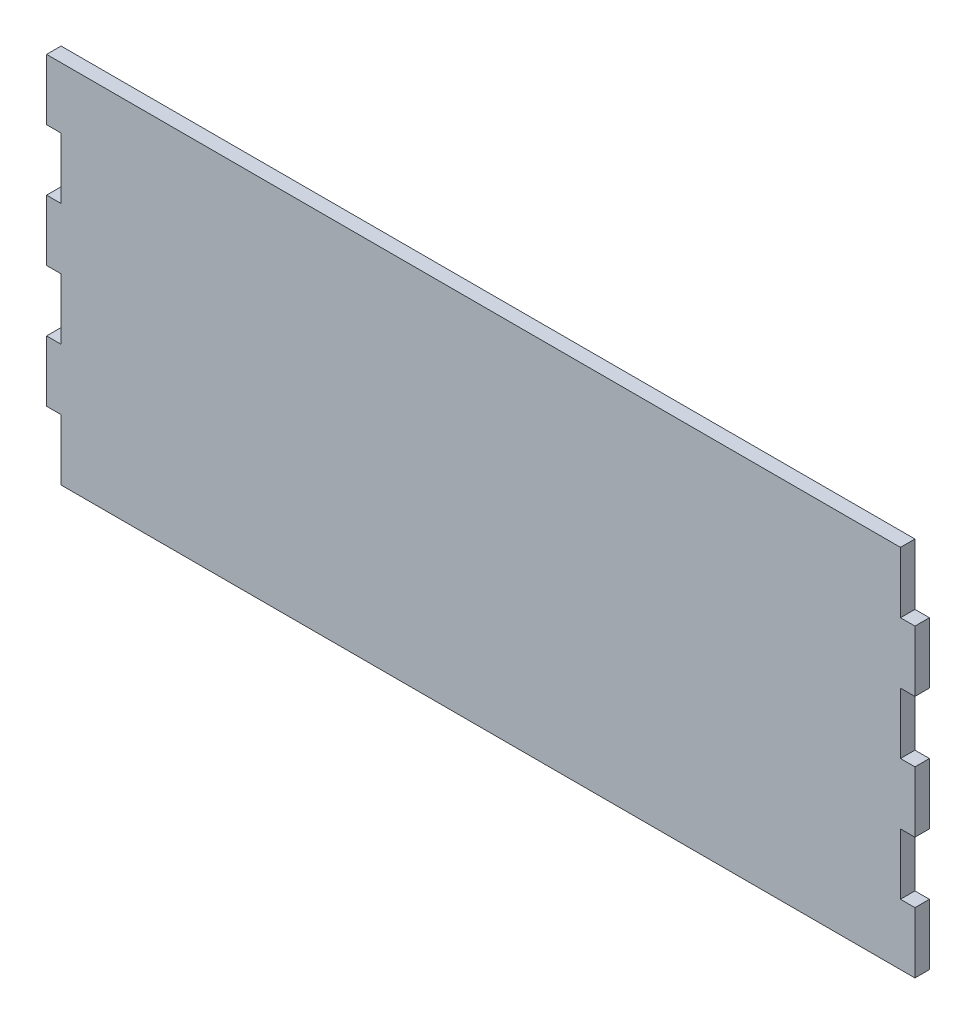
ISO-10303-21;
HEADER;
FILE_DESCRIPTION(('STEP AP214'),'2;1');
FILE_NAME('part.step','',(''),(''),'','','');
FILE_SCHEMA(('AUTOMOTIVE_DESIGN { 1 0 10303 214 1 1 1 1 }'));
ENDSEC;
DATA;
#1=APPLICATION_CONTEXT('core data for automotive mechanical design processes');
#2=APPLICATION_PROTOCOL_DEFINITION('international standard','automotive_design',2000,#1);
#3=PRODUCT_CONTEXT('',#1,'mechanical');
#4=PRODUCT('Part','Part','',(#3));
#5=PRODUCT_RELATED_PRODUCT_CATEGORY('part','',(#4));
#6=PRODUCT_DEFINITION_FORMATION('','',#4);
#7=PRODUCT_DEFINITION_CONTEXT('part definition',#1,'design');
#8=PRODUCT_DEFINITION('design','',#6,#7);
#9=PRODUCT_DEFINITION_SHAPE('','',#8);
#10=(LENGTH_UNIT() NAMED_UNIT(*) SI_UNIT(.MILLI.,.METRE.));
#11=(NAMED_UNIT(*) PLANE_ANGLE_UNIT() SI_UNIT($,.RADIAN.));
#12=(NAMED_UNIT(*) SI_UNIT($,.STERADIAN.) SOLID_ANGLE_UNIT());
#13=UNCERTAINTY_MEASURE_WITH_UNIT(LENGTH_MEASURE(1.E-05),#10,'distance_accuracy_value','');
#14=(GEOMETRIC_REPRESENTATION_CONTEXT(3) GLOBAL_UNCERTAINTY_ASSIGNED_CONTEXT((#13)) GLOBAL_UNIT_ASSIGNED_CONTEXT((#10,
#11,#12)) REPRESENTATION_CONTEXT('',''));
#15=CARTESIAN_POINT('',(0.,0.,0.));
#16=DIRECTION('',(0.,0.,1.));
#17=DIRECTION('',(1.,0.,0.));
#18=AXIS2_PLACEMENT_3D('',#15,#16,#17);
#19=CARTESIAN_POINT('',(87.,-37.905,3.));
#20=DIRECTION('',(-1.,0.,0.));
#21=DIRECTION('',(0.,0.,1.));
#22=AXIS2_PLACEMENT_3D('',#19,#20,#21);
#23=PLANE('',#22);
#24=DIRECTION('',(0.,1.,0.));
#25=VECTOR('',#24,1.);
#26=CARTESIAN_POINT('',(87.,-37.905,3.));
#27=LINE('',#26,#25);
#28=CARTESIAN_POINT('',(87.,0.,3.));
#29=VERTEX_POINT('',#28);
#30=CARTESIAN_POINT('',(87.,12.635,3.));
#31=VERTEX_POINT('',#30);
#32=EDGE_CURVE('E65',#29,#31,#27,.T.);
#33=ORIENTED_EDGE('',*,*,#32,.F.);
#34=DIRECTION('',(0.,0.,1.));
#35=VECTOR('',#34,1.);
#36=CARTESIAN_POINT('',(87.0000000000003,0.,0.));
#37=LINE('',#36,#35);
#38=CARTESIAN_POINT('',(87.0000000000003,0.,0.));
#39=VERTEX_POINT('',#38);
#40=EDGE_CURVE('E261',#39,#29,#37,.T.);
#41=ORIENTED_EDGE('',*,*,#40,.F.);
#42=DIRECTION('',(0.,1.,0.));
#43=VECTOR('',#42,1.);
#44=CARTESIAN_POINT('',(87.,-37.905,0.));
#45=LINE('',#44,#43);
#46=CARTESIAN_POINT('',(87.,12.635,0.));
#47=VERTEX_POINT('',#46);
#48=EDGE_CURVE('E218',#39,#47,#45,.T.);
#49=ORIENTED_EDGE('',*,*,#48,.T.);
#50=DIRECTION('',(0.,0.,1.));
#51=VECTOR('',#50,1.);
#52=CARTESIAN_POINT('',(87.,12.635,0.));
#53=LINE('',#52,#51);
#54=EDGE_CURVE('E296',#47,#31,#53,.T.);
#55=ORIENTED_EDGE('',*,*,#54,.T.);
#56=EDGE_LOOP('',(#33,#41,#49,#55));
#57=FACE_BOUND('',#56,.T.);
#58=ADVANCED_FACE('F41',(#57),#23,.F.);
#59=DIRECTION('',(0.,0.,1.));
#60=VECTOR('',#59,1.);
#61=CARTESIAN_POINT('',(87.,25.27,0.));
#62=LINE('',#61,#60);
#63=CARTESIAN_POINT('',(87.,25.27,0.));
#64=VERTEX_POINT('',#63);
#65=CARTESIAN_POINT('',(87.,25.27,3.));
#66=VERTEX_POINT('',#65);
#67=EDGE_CURVE('E307',#64,#66,#62,.T.);
#68=ORIENTED_EDGE('',*,*,#67,.F.);
#69=CARTESIAN_POINT('',(87.,37.905,0.));
#70=VERTEX_POINT('',#69);
#71=EDGE_CURVE('E220',#64,#70,#45,.T.);
#72=ORIENTED_EDGE('',*,*,#71,.T.);
#73=DIRECTION('',(0.,0.,-1.));
#74=VECTOR('',#73,1.);
#75=CARTESIAN_POINT('',(87.,37.905,3.));
#76=LINE('',#75,#74);
#77=CARTESIAN_POINT('',(87.,37.905,3.));
#78=VERTEX_POINT('',#77);
#79=EDGE_CURVE('E50',#78,#70,#76,.T.);
#80=ORIENTED_EDGE('',*,*,#79,.F.);
#81=EDGE_CURVE('E429',#66,#78,#27,.T.);
#82=ORIENTED_EDGE('',*,*,#81,.F.);
#83=EDGE_LOOP('',(#68,#72,#80,#82));
#84=FACE_BOUND('',#83,.T.);
#85=ADVANCED_FACE('F526',(#84),#23,.F.);
#86=CARTESIAN_POINT('',(-87.,-37.905,3.));
#87=DIRECTION('',(1.,0.,0.));
#88=DIRECTION('',(0.,0.,-1.));
#89=AXIS2_PLACEMENT_3D('',#86,#87,#88);
#90=PLANE('',#89);
#91=DIRECTION('',(0.,-1.,0.));
#92=VECTOR('',#91,1.);
#93=CARTESIAN_POINT('',(-87.,-37.905,0.));
#94=LINE('',#93,#92);
#95=CARTESIAN_POINT('',(-86.9999999999997,0.,0.));
#96=VERTEX_POINT('',#95);
#97=CARTESIAN_POINT('',(-87.,-12.635,0.));
#98=VERTEX_POINT('',#97);
#99=EDGE_CURVE('E439',#96,#98,#94,.T.);
#100=ORIENTED_EDGE('',*,*,#99,.T.);
#101=DIRECTION('',(0.,0.,1.));
#102=VECTOR('',#101,1.);
#103=CARTESIAN_POINT('',(-86.9999999999995,-12.635,0.));
#104=LINE('',#103,#102);
#105=CARTESIAN_POINT('',(-87.,-12.635,3.));
#106=VERTEX_POINT('',#105);
#107=EDGE_CURVE('E343',#98,#106,#104,.T.);
#108=ORIENTED_EDGE('',*,*,#107,.T.);
#109=DIRECTION('',(0.,-1.,0.));
#110=VECTOR('',#109,1.);
#111=CARTESIAN_POINT('',(-87.,-37.905,3.));
#112=LINE('',#111,#110);
#113=CARTESIAN_POINT('',(-87.,0.,3.));
#114=VERTEX_POINT('',#113);
#115=EDGE_CURVE('E425',#114,#106,#112,.T.);
#116=ORIENTED_EDGE('',*,*,#115,.F.);
#117=DIRECTION('',(0.,0.,1.));
#118=VECTOR('',#117,1.);
#119=CARTESIAN_POINT('',(-86.9999999999997,0.,0.));
#120=LINE('',#119,#118);
#121=EDGE_CURVE('E384',#96,#114,#120,.T.);
#122=ORIENTED_EDGE('',*,*,#121,.F.);
#123=EDGE_LOOP('',(#100,#108,#116,#122));
#124=FACE_BOUND('',#123,.T.);
#125=ADVANCED_FACE('F483',(#124),#90,.F.);
#126=CARTESIAN_POINT('',(-87.,25.27,0.));
#127=VERTEX_POINT('',#126);
#128=CARTESIAN_POINT('',(-87.,12.635,0.));
#129=VERTEX_POINT('',#128);
#130=EDGE_CURVE('E435',#127,#129,#94,.T.);
#131=ORIENTED_EDGE('',*,*,#130,.T.);
#132=DIRECTION('',(0.,0.,1.));
#133=VECTOR('',#132,1.);
#134=CARTESIAN_POINT('',(-86.9999999999997,12.635,0.));
#135=LINE('',#134,#133);
#136=CARTESIAN_POINT('',(-87.,12.635,3.));
#137=VERTEX_POINT('',#136);
#138=EDGE_CURVE('E380',#129,#137,#135,.T.);
#139=ORIENTED_EDGE('',*,*,#138,.T.);
#140=CARTESIAN_POINT('',(-87.,25.27,3.));
#141=VERTEX_POINT('',#140);
#142=EDGE_CURVE('E420',#141,#137,#112,.T.);
#143=ORIENTED_EDGE('',*,*,#142,.F.);
#144=DIRECTION('',(0.,0.,1.));
#145=VECTOR('',#144,1.);
#146=CARTESIAN_POINT('',(-87.,25.27,0.));
#147=LINE('',#146,#145);
#148=EDGE_CURVE('E409',#127,#141,#147,.T.);
#149=ORIENTED_EDGE('',*,*,#148,.F.);
#150=EDGE_LOOP('',(#131,#139,#143,#149));
#151=FACE_BOUND('',#150,.T.);
#152=ADVANCED_FACE('F466',(#151),#90,.F.);
#153=CARTESIAN_POINT('',(-87.,-25.27,3.));
#154=VERTEX_POINT('',#153);
#155=CARTESIAN_POINT('',(-87.,-37.905,3.));
#156=VERTEX_POINT('',#155);
#157=EDGE_CURVE('E426',#154,#156,#112,.T.);
#158=ORIENTED_EDGE('',*,*,#157,.F.);
#159=DIRECTION('',(0.,0.,1.));
#160=VECTOR('',#159,1.);
#161=CARTESIAN_POINT('',(-86.9999999999995,-25.27,0.));
#162=LINE('',#161,#160);
#163=CARTESIAN_POINT('',(-86.9999999999995,-25.27,0.));
#164=VERTEX_POINT('',#163);
#165=EDGE_CURVE('E347',#164,#154,#162,.T.);
#166=ORIENTED_EDGE('',*,*,#165,.F.);
#167=CARTESIAN_POINT('',(-87.,-37.905,0.));
#168=VERTEX_POINT('',#167);
#169=EDGE_CURVE('E413',#164,#168,#94,.T.);
#170=ORIENTED_EDGE('',*,*,#169,.T.);
#171=DIRECTION('',(0.,0.,-1.));
#172=VECTOR('',#171,1.);
#173=CARTESIAN_POINT('',(-87.,-37.905,3.));
#174=LINE('',#173,#172);
#175=EDGE_CURVE('E11',#156,#168,#174,.T.);
#176=ORIENTED_EDGE('',*,*,#175,.F.);
#177=EDGE_LOOP('',(#158,#166,#170,#176));
#178=FACE_BOUND('',#177,.T.);
#179=ADVANCED_FACE('F43',(#178),#90,.F.);
#180=CARTESIAN_POINT('',(87.,-37.905,3.));
#181=DIRECTION('',(0.,1.,0.));
#182=DIRECTION('',(-1.,0.,0.));
#183=AXIS2_PLACEMENT_3D('',#180,#181,#182);
#184=PLANE('',#183);
#185=DIRECTION('',(1.,0.,0.));
#186=VECTOR('',#185,1.);
#187=CARTESIAN_POINT('',(87.,-37.905,0.));
#188=LINE('',#187,#186);
#189=CARTESIAN_POINT('',(90.0000000000006,-37.905,0.));
#190=VERTEX_POINT('',#189);
#191=EDGE_CURVE('E438',#168,#190,#188,.T.);
#192=ORIENTED_EDGE('',*,*,#191,.T.);
#193=DIRECTION('',(0.,0.,1.));
#194=VECTOR('',#193,1.);
#195=CARTESIAN_POINT('',(90.0000000000006,-37.905,0.));
#196=LINE('',#195,#194);
#197=CARTESIAN_POINT('',(90.0000000000006,-37.905,3.));
#198=VERTEX_POINT('',#197);
#199=EDGE_CURVE('E227',#190,#198,#196,.T.);
#200=ORIENTED_EDGE('',*,*,#199,.T.);
#201=DIRECTION('',(1.,0.,0.));
#202=VECTOR('',#201,1.);
#203=CARTESIAN_POINT('',(87.,-37.905,3.));
#204=LINE('',#203,#202);
#205=EDGE_CURVE('E424',#156,#198,#204,.T.);
#206=ORIENTED_EDGE('',*,*,#205,.F.);
#207=ORIENTED_EDGE('',*,*,#175,.T.);
#208=EDGE_LOOP('',(#192,#200,#206,#207));
#209=FACE_BOUND('',#208,.T.);
#210=ADVANCED_FACE('F494',(#209),#184,.F.);
#211=CARTESIAN_POINT('',(87.,-25.27,3.));
#212=VERTEX_POINT('',#211);
#213=CARTESIAN_POINT('',(87.,-12.635,3.));
#214=VERTEX_POINT('',#213);
#215=EDGE_CURVE('E57',#212,#214,#27,.T.);
#216=ORIENTED_EDGE('',*,*,#215,.F.);
#217=DIRECTION('',(0.,0.,1.));
#218=VECTOR('',#217,1.);
#219=CARTESIAN_POINT('',(87.0000000000006,-25.27,0.));
#220=LINE('',#219,#218);
#221=CARTESIAN_POINT('',(87.0000000000006,-25.27,0.));
#222=VERTEX_POINT('',#221);
#223=EDGE_CURVE('E221',#222,#212,#220,.T.);
#224=ORIENTED_EDGE('',*,*,#223,.F.);
#225=CARTESIAN_POINT('',(87.,-12.635,0.));
#226=VERTEX_POINT('',#225);
#227=EDGE_CURVE('E205',#222,#226,#45,.T.);
#228=ORIENTED_EDGE('',*,*,#227,.T.);
#229=DIRECTION('',(0.,0.,1.));
#230=VECTOR('',#229,1.);
#231=CARTESIAN_POINT('',(87.0000000000003,-12.635,0.));
#232=LINE('',#231,#230);
#233=EDGE_CURVE('E279',#226,#214,#232,.T.);
#234=ORIENTED_EDGE('',*,*,#233,.T.);
#235=EDGE_LOOP('',(#216,#224,#228,#234));
#236=FACE_BOUND('',#235,.T.);
#237=ADVANCED_FACE('F222',(#236),#23,.F.);
#238=CARTESIAN_POINT('',(87.,37.905,3.));
#239=DIRECTION('',(0.,-1.,0.));
#240=DIRECTION('',(1.,0.,0.));
#241=AXIS2_PLACEMENT_3D('',#238,#239,#240);
#242=PLANE('',#241);
#243=DIRECTION('',(-1.,0.,0.));
#244=VECTOR('',#243,1.);
#245=CARTESIAN_POINT('',(87.,37.905,0.));
#246=LINE('',#245,#244);
#247=CARTESIAN_POINT('',(-90.,37.905,0.));
#248=VERTEX_POINT('',#247);
#249=EDGE_CURVE('E217',#70,#248,#246,.T.);
#250=ORIENTED_EDGE('',*,*,#249,.T.);
#251=DIRECTION('',(0.,0.,1.));
#252=VECTOR('',#251,1.);
#253=CARTESIAN_POINT('',(-90.,37.905,0.));
#254=LINE('',#253,#252);
#255=CARTESIAN_POINT('',(-90.,37.905,3.));
#256=VERTEX_POINT('',#255);
#257=EDGE_CURVE('E402',#248,#256,#254,.T.);
#258=ORIENTED_EDGE('',*,*,#257,.T.);
#259=DIRECTION('',(-1.,0.,0.));
#260=VECTOR('',#259,1.);
#261=CARTESIAN_POINT('',(87.,37.905,3.));
#262=LINE('',#261,#260);
#263=EDGE_CURVE('E432',#78,#256,#262,.T.);
#264=ORIENTED_EDGE('',*,*,#263,.F.);
#265=ORIENTED_EDGE('',*,*,#79,.T.);
#266=EDGE_LOOP('',(#250,#258,#264,#265));
#267=FACE_BOUND('',#266,.T.);
#268=ADVANCED_FACE('F449',(#267),#242,.F.);
#269=CARTESIAN_POINT('',(0.,0.,3.));
#270=DIRECTION('',(0.,0.,1.));
#271=DIRECTION('',(1.,0.,0.));
#272=AXIS2_PLACEMENT_3D('',#269,#270,#271);
#273=PLANE('',#272);
#274=ORIENTED_EDGE('',*,*,#263,.T.);
#275=DIRECTION('',(0.,-1.,0.));
#276=VECTOR('',#275,1.);
#277=CARTESIAN_POINT('',(-90.,37.905,3.));
#278=LINE('',#277,#276);
#279=CARTESIAN_POINT('',(-90.,25.27,3.));
#280=VERTEX_POINT('',#279);
#281=EDGE_CURVE('E383',#256,#280,#278,.T.);
#282=ORIENTED_EDGE('',*,*,#281,.T.);
#283=DIRECTION('',(1.,0.,0.));
#284=VECTOR('',#283,1.);
#285=CARTESIAN_POINT('',(-87.,25.27,3.));
#286=LINE('',#285,#284);
#287=EDGE_CURVE('E398',#280,#141,#286,.T.);
#288=ORIENTED_EDGE('',*,*,#287,.T.);
#289=ORIENTED_EDGE('',*,*,#142,.T.);
#290=DIRECTION('',(-1.,0.,0.));
#291=VECTOR('',#290,1.);
#292=CARTESIAN_POINT('',(-86.9999999999997,12.635,3.));
#293=LINE('',#292,#291);
#294=CARTESIAN_POINT('',(-89.9999999999997,12.635,3.));
#295=VERTEX_POINT('',#294);
#296=EDGE_CURVE('E346',#137,#295,#293,.T.);
#297=ORIENTED_EDGE('',*,*,#296,.T.);
#298=DIRECTION('',(0.,-1.,0.));
#299=VECTOR('',#298,1.);
#300=CARTESIAN_POINT('',(-89.9999999999997,12.635,3.));
#301=LINE('',#300,#299);
#302=CARTESIAN_POINT('',(-89.9999999999997,0.,3.));
#303=VERTEX_POINT('',#302);
#304=EDGE_CURVE('E373',#295,#303,#301,.T.);
#305=ORIENTED_EDGE('',*,*,#304,.T.);
#306=DIRECTION('',(1.,0.,0.));
#307=VECTOR('',#306,1.);
#308=CARTESIAN_POINT('',(-86.9999999999997,0.,3.));
#309=LINE('',#308,#307);
#310=EDGE_CURVE('E361',#303,#114,#309,.T.);
#311=ORIENTED_EDGE('',*,*,#310,.T.);
#312=ORIENTED_EDGE('',*,*,#115,.T.);
#313=DIRECTION('',(-1.,0.,0.));
#314=VECTOR('',#313,1.);
#315=CARTESIAN_POINT('',(-86.9999999999995,-12.635,3.));
#316=LINE('',#315,#314);
#317=CARTESIAN_POINT('',(-89.9999999999995,-12.635,3.));
#318=VERTEX_POINT('',#317);
#319=EDGE_CURVE('E310',#106,#318,#316,.T.);
#320=ORIENTED_EDGE('',*,*,#319,.T.);
#321=DIRECTION('',(0.,-1.,0.));
#322=VECTOR('',#321,1.);
#323=CARTESIAN_POINT('',(-89.9999999999995,-12.635,3.));
#324=LINE('',#323,#322);
#325=CARTESIAN_POINT('',(-89.9999999999995,-25.27,3.));
#326=VERTEX_POINT('',#325);
#327=EDGE_CURVE('E336',#318,#326,#324,.T.);
#328=ORIENTED_EDGE('',*,*,#327,.T.);
#329=DIRECTION('',(1.,0.,0.));
#330=VECTOR('',#329,1.);
#331=CARTESIAN_POINT('',(-86.9999999999995,-25.27,3.));
#332=LINE('',#331,#330);
#333=EDGE_CURVE('E324',#326,#154,#332,.T.);
#334=ORIENTED_EDGE('',*,*,#333,.T.);
#335=ORIENTED_EDGE('',*,*,#157,.T.);
#336=ORIENTED_EDGE('',*,*,#205,.T.);
#337=DIRECTION('',(0.,1.,0.));
#338=VECTOR('',#337,1.);
#339=CARTESIAN_POINT('',(90.0000000000006,-25.27,3.));
#340=LINE('',#339,#338);
#341=CARTESIAN_POINT('',(90.0000000000006,-25.27,3.));
#342=VERTEX_POINT('',#341);
#343=EDGE_CURVE('E233',#198,#342,#340,.T.);
#344=ORIENTED_EDGE('',*,*,#343,.T.);
#345=DIRECTION('',(-1.,0.,0.));
#346=VECTOR('',#345,1.);
#347=CARTESIAN_POINT('',(87.0000000000006,-25.27,3.));
#348=LINE('',#347,#346);
#349=EDGE_CURVE('E239',#342,#212,#348,.T.);
#350=ORIENTED_EDGE('',*,*,#349,.T.);
#351=ORIENTED_EDGE('',*,*,#215,.T.);
#352=DIRECTION('',(1.,0.,0.));
#353=VECTOR('',#352,1.);
#354=CARTESIAN_POINT('',(87.0000000000003,-12.635,3.));
#355=LINE('',#354,#353);
#356=CARTESIAN_POINT('',(90.0000000000003,-12.635,3.));
#357=VERTEX_POINT('',#356);
#358=EDGE_CURVE('E265',#214,#357,#355,.T.);
#359=ORIENTED_EDGE('',*,*,#358,.T.);
#360=DIRECTION('',(0.,1.,0.));
#361=VECTOR('',#360,1.);
#362=CARTESIAN_POINT('',(90.0000000000003,0.,3.));
#363=LINE('',#362,#361);
#364=CARTESIAN_POINT('',(90.0000000000003,0.,3.));
#365=VERTEX_POINT('',#364);
#366=EDGE_CURVE('E254',#357,#365,#363,.T.);
#367=ORIENTED_EDGE('',*,*,#366,.T.);
#368=DIRECTION('',(-1.,0.,0.));
#369=VECTOR('',#368,1.);
#370=CARTESIAN_POINT('',(87.0000000000003,0.,3.));
#371=LINE('',#370,#369);
#372=EDGE_CURVE('E246',#365,#29,#371,.T.);
#373=ORIENTED_EDGE('',*,*,#372,.T.);
#374=ORIENTED_EDGE('',*,*,#32,.T.);
#375=DIRECTION('',(1.,0.,0.));
#376=VECTOR('',#375,1.);
#377=CARTESIAN_POINT('',(87.,12.635,3.));
#378=LINE('',#377,#376);
#379=CARTESIAN_POINT('',(90.,12.635,3.));
#380=VERTEX_POINT('',#379);
#381=EDGE_CURVE('E275',#31,#380,#378,.T.);
#382=ORIENTED_EDGE('',*,*,#381,.T.);
#383=DIRECTION('',(0.,1.,0.));
#384=VECTOR('',#383,1.);
#385=CARTESIAN_POINT('',(90.,25.27,3.));
#386=LINE('',#385,#384);
#387=CARTESIAN_POINT('',(90.,25.27,3.));
#388=VERTEX_POINT('',#387);
#389=EDGE_CURVE('E300',#380,#388,#386,.T.);
#390=ORIENTED_EDGE('',*,*,#389,.T.);
#391=DIRECTION('',(-1.,0.,0.));
#392=VECTOR('',#391,1.);
#393=CARTESIAN_POINT('',(87.,25.27,3.));
#394=LINE('',#393,#392);
#395=EDGE_CURVE('E289',#388,#66,#394,.T.);
#396=ORIENTED_EDGE('',*,*,#395,.T.);
#397=ORIENTED_EDGE('',*,*,#81,.T.);
#398=EDGE_LOOP('',(#274,#282,#288,#289,#297,#305,#311,#312,#320,#328,#334,#335,#336,#344,#350,
#351,#359,#367,#373,#374,#382,#390,#396,#397));
#399=FACE_BOUND('',#398,.T.);
#400=ADVANCED_FACE('F462',(#399),#273,.T.);
#401=CARTESIAN_POINT('',(0.,0.,0.));
#402=DIRECTION('',(0.,0.,1.));
#403=DIRECTION('',(1.,0.,0.));
#404=AXIS2_PLACEMENT_3D('',#401,#402,#403);
#405=PLANE('',#404);
#406=ORIENTED_EDGE('',*,*,#130,.F.);
#407=DIRECTION('',(1.,0.,0.));
#408=VECTOR('',#407,1.);
#409=CARTESIAN_POINT('',(-87.,25.27,0.));
#410=LINE('',#409,#408);
#411=CARTESIAN_POINT('',(-90.,25.27,0.));
#412=VERTEX_POINT('',#411);
#413=EDGE_CURVE('E397',#412,#127,#410,.T.);
#414=ORIENTED_EDGE('',*,*,#413,.F.);
#415=DIRECTION('',(0.,-1.,0.));
#416=VECTOR('',#415,1.);
#417=CARTESIAN_POINT('',(-90.,37.905,0.));
#418=LINE('',#417,#416);
#419=EDGE_CURVE('E393',#248,#412,#418,.T.);
#420=ORIENTED_EDGE('',*,*,#419,.F.);
#421=ORIENTED_EDGE('',*,*,#249,.F.);
#422=ORIENTED_EDGE('',*,*,#71,.F.);
#423=DIRECTION('',(-1.,0.,0.));
#424=VECTOR('',#423,1.);
#425=CARTESIAN_POINT('',(87.,25.27,0.));
#426=LINE('',#425,#424);
#427=CARTESIAN_POINT('',(90.,25.27,0.));
#428=VERTEX_POINT('',#427);
#429=EDGE_CURVE('E293',#428,#64,#426,.T.);
#430=ORIENTED_EDGE('',*,*,#429,.F.);
#431=DIRECTION('',(0.,1.,0.));
#432=VECTOR('',#431,1.);
#433=CARTESIAN_POINT('',(90.,25.27,0.));
#434=LINE('',#433,#432);
#435=CARTESIAN_POINT('',(90.,12.635,0.));
#436=VERTEX_POINT('',#435);
#437=EDGE_CURVE('E288',#436,#428,#434,.T.);
#438=ORIENTED_EDGE('',*,*,#437,.F.);
#439=DIRECTION('',(1.,0.,0.));
#440=VECTOR('',#439,1.);
#441=CARTESIAN_POINT('',(87.,12.635,0.));
#442=LINE('',#441,#440);
#443=EDGE_CURVE('E284',#47,#436,#442,.T.);
#444=ORIENTED_EDGE('',*,*,#443,.F.);
#445=ORIENTED_EDGE('',*,*,#48,.F.);
#446=DIRECTION('',(-1.,0.,0.));
#447=VECTOR('',#446,1.);
#448=CARTESIAN_POINT('',(87.0000000000003,0.,0.));
#449=LINE('',#448,#447);
#450=CARTESIAN_POINT('',(90.0000000000003,0.,0.));
#451=VERTEX_POINT('',#450);
#452=EDGE_CURVE('E250',#451,#39,#449,.T.);
#453=ORIENTED_EDGE('',*,*,#452,.F.);
#454=DIRECTION('',(0.,1.,0.));
#455=VECTOR('',#454,1.);
#456=CARTESIAN_POINT('',(90.0000000000003,0.,0.));
#457=LINE('',#456,#455);
#458=CARTESIAN_POINT('',(90.0000000000003,-12.635,0.));
#459=VERTEX_POINT('',#458);
#460=EDGE_CURVE('E257',#459,#451,#457,.T.);
#461=ORIENTED_EDGE('',*,*,#460,.F.);
#462=DIRECTION('',(1.,0.,0.));
#463=VECTOR('',#462,1.);
#464=CARTESIAN_POINT('',(87.0000000000003,-12.635,0.));
#465=LINE('',#464,#463);
#466=EDGE_CURVE('E214',#226,#459,#465,.T.);
#467=ORIENTED_EDGE('',*,*,#466,.F.);
#468=ORIENTED_EDGE('',*,*,#227,.F.);
#469=DIRECTION('',(-1.,0.,0.));
#470=VECTOR('',#469,1.);
#471=CARTESIAN_POINT('',(87.0000000000006,-25.27,0.));
#472=LINE('',#471,#470);
#473=CARTESIAN_POINT('',(90.0000000000006,-25.27,0.));
#474=VERTEX_POINT('',#473);
#475=EDGE_CURVE('E210',#474,#222,#472,.T.);
#476=ORIENTED_EDGE('',*,*,#475,.F.);
#477=DIRECTION('',(0.,1.,0.));
#478=VECTOR('',#477,1.);
#479=CARTESIAN_POINT('',(90.0000000000006,-25.27,0.));
#480=LINE('',#479,#478);
#481=EDGE_CURVE('E228',#190,#474,#480,.T.);
#482=ORIENTED_EDGE('',*,*,#481,.F.);
#483=ORIENTED_EDGE('',*,*,#191,.F.);
#484=ORIENTED_EDGE('',*,*,#169,.F.);
#485=DIRECTION('',(1.,0.,0.));
#486=VECTOR('',#485,1.);
#487=CARTESIAN_POINT('',(-86.9999999999995,-25.27,0.));
#488=LINE('',#487,#486);
#489=CARTESIAN_POINT('',(-89.9999999999995,-25.27,0.));
#490=VERTEX_POINT('',#489);
#491=EDGE_CURVE('E328',#490,#164,#488,.T.);
#492=ORIENTED_EDGE('',*,*,#491,.F.);
#493=DIRECTION('',(0.,-1.,0.));
#494=VECTOR('',#493,1.);
#495=CARTESIAN_POINT('',(-89.9999999999995,-12.635,0.));
#496=LINE('',#495,#494);
#497=CARTESIAN_POINT('',(-89.9999999999995,-12.635,0.));
#498=VERTEX_POINT('',#497);
#499=EDGE_CURVE('E323',#498,#490,#496,.T.);
#500=ORIENTED_EDGE('',*,*,#499,.F.);
#501=DIRECTION('',(-1.,0.,0.));
#502=VECTOR('',#501,1.);
#503=CARTESIAN_POINT('',(-86.9999999999995,-12.635,0.));
#504=LINE('',#503,#502);
#505=EDGE_CURVE('E319',#98,#498,#504,.T.);
#506=ORIENTED_EDGE('',*,*,#505,.F.);
#507=ORIENTED_EDGE('',*,*,#99,.F.);
#508=DIRECTION('',(1.,0.,0.));
#509=VECTOR('',#508,1.);
#510=CARTESIAN_POINT('',(-86.9999999999997,0.,0.));
#511=LINE('',#510,#509);
#512=CARTESIAN_POINT('',(-89.9999999999997,0.,0.));
#513=VERTEX_POINT('',#512);
#514=EDGE_CURVE('E365',#513,#96,#511,.T.);
#515=ORIENTED_EDGE('',*,*,#514,.F.);
#516=DIRECTION('',(0.,-1.,0.));
#517=VECTOR('',#516,1.);
#518=CARTESIAN_POINT('',(-89.9999999999997,12.635,0.));
#519=LINE('',#518,#517);
#520=CARTESIAN_POINT('',(-89.9999999999997,12.635,0.));
#521=VERTEX_POINT('',#520);
#522=EDGE_CURVE('E360',#521,#513,#519,.T.);
#523=ORIENTED_EDGE('',*,*,#522,.F.);
#524=DIRECTION('',(-1.,0.,0.));
#525=VECTOR('',#524,1.);
#526=CARTESIAN_POINT('',(-86.9999999999997,12.635,0.));
#527=LINE('',#526,#525);
#528=EDGE_CURVE('E356',#129,#521,#527,.T.);
#529=ORIENTED_EDGE('',*,*,#528,.F.);
#530=EDGE_LOOP('',(#406,#414,#420,#421,#422,#430,#438,#444,#445,#453,#461,#467,#468,#476,#482,
#483,#484,#492,#500,#506,#507,#515,#523,#529));
#531=FACE_BOUND('',#530,.T.);
#532=ADVANCED_FACE('F207',(#531),#405,.F.);
#533=CARTESIAN_POINT('',(-87.,25.27,0.));
#534=DIRECTION('',(0.,-1.,0.));
#535=DIRECTION('',(0.,0.,-1.));
#536=AXIS2_PLACEMENT_3D('',#533,#534,#535);
#537=PLANE('',#536);
#538=ORIENTED_EDGE('',*,*,#287,.F.);
#539=DIRECTION('',(0.,0.,1.));
#540=VECTOR('',#539,1.);
#541=CARTESIAN_POINT('',(-90.,25.27,0.));
#542=LINE('',#541,#540);
#543=EDGE_CURVE('E414',#412,#280,#542,.T.);
#544=ORIENTED_EDGE('',*,*,#543,.F.);
#545=ORIENTED_EDGE('',*,*,#413,.T.);
#546=ORIENTED_EDGE('',*,*,#148,.T.);
#547=EDGE_LOOP('',(#538,#544,#545,#546));
#548=FACE_BOUND('',#547,.T.);
#549=ADVANCED_FACE('F464',(#548),#537,.T.);
#550=CARTESIAN_POINT('',(-90.,37.905,0.));
#551=DIRECTION('',(-1.,0.,0.));
#552=DIRECTION('',(0.,0.,1.));
#553=AXIS2_PLACEMENT_3D('',#550,#551,#552);
#554=PLANE('',#553);
#555=ORIENTED_EDGE('',*,*,#281,.F.);
#556=ORIENTED_EDGE('',*,*,#257,.F.);
#557=ORIENTED_EDGE('',*,*,#419,.T.);
#558=ORIENTED_EDGE('',*,*,#543,.T.);
#559=EDGE_LOOP('',(#555,#556,#557,#558));
#560=FACE_BOUND('',#559,.T.);
#561=ADVANCED_FACE('F459',(#560),#554,.T.);
#562=CARTESIAN_POINT('',(-86.9999999999997,12.635,0.));
#563=DIRECTION('',(0.,1.,0.));
#564=DIRECTION('',(0.,0.,1.));
#565=AXIS2_PLACEMENT_3D('',#562,#563,#564);
#566=PLANE('',#565);
#567=ORIENTED_EDGE('',*,*,#296,.F.);
#568=ORIENTED_EDGE('',*,*,#138,.F.);
#569=ORIENTED_EDGE('',*,*,#528,.T.);
#570=DIRECTION('',(0.,0.,1.));
#571=VECTOR('',#570,1.);
#572=CARTESIAN_POINT('',(-89.9999999999997,12.635,0.));
#573=LINE('',#572,#571);
#574=EDGE_CURVE('E369',#521,#295,#573,.T.);
#575=ORIENTED_EDGE('',*,*,#574,.T.);
#576=EDGE_LOOP('',(#567,#568,#569,#575));
#577=FACE_BOUND('',#576,.T.);
#578=ADVANCED_FACE('F473',(#577),#566,.T.);
#579=CARTESIAN_POINT('',(-86.9999999999997,0.,0.));
#580=DIRECTION('',(0.,-1.,0.));
#581=DIRECTION('',(0.,0.,-1.));
#582=AXIS2_PLACEMENT_3D('',#579,#580,#581);
#583=PLANE('',#582);
#584=ORIENTED_EDGE('',*,*,#310,.F.);
#585=DIRECTION('',(0.,0.,1.));
#586=VECTOR('',#585,1.);
#587=CARTESIAN_POINT('',(-89.9999999999997,0.,0.));
#588=LINE('',#587,#586);
#589=EDGE_CURVE('E388',#513,#303,#588,.T.);
#590=ORIENTED_EDGE('',*,*,#589,.F.);
#591=ORIENTED_EDGE('',*,*,#514,.T.);
#592=ORIENTED_EDGE('',*,*,#121,.T.);
#593=EDGE_LOOP('',(#584,#590,#591,#592));
#594=FACE_BOUND('',#593,.T.);
#595=ADVANCED_FACE('F480',(#594),#583,.T.);
#596=CARTESIAN_POINT('',(-89.9999999999997,12.635,0.));
#597=DIRECTION('',(-1.,0.,0.));
#598=DIRECTION('',(0.,0.,1.));
#599=AXIS2_PLACEMENT_3D('',#596,#597,#598);
#600=PLANE('',#599);
#601=ORIENTED_EDGE('',*,*,#304,.F.);
#602=ORIENTED_EDGE('',*,*,#574,.F.);
#603=ORIENTED_EDGE('',*,*,#522,.T.);
#604=ORIENTED_EDGE('',*,*,#589,.T.);
#605=EDGE_LOOP('',(#601,#602,#603,#604));
#606=FACE_BOUND('',#605,.T.);
#607=ADVANCED_FACE('F478',(#606),#600,.T.);
#608=CARTESIAN_POINT('',(-86.9999999999995,-12.635,0.));
#609=DIRECTION('',(0.,1.,0.));
#610=DIRECTION('',(0.,0.,1.));
#611=AXIS2_PLACEMENT_3D('',#608,#609,#610);
#612=PLANE('',#611);
#613=ORIENTED_EDGE('',*,*,#319,.F.);
#614=ORIENTED_EDGE('',*,*,#107,.F.);
#615=ORIENTED_EDGE('',*,*,#505,.T.);
#616=DIRECTION('',(0.,0.,1.));
#617=VECTOR('',#616,1.);
#618=CARTESIAN_POINT('',(-89.9999999999995,-12.635,0.));
#619=LINE('',#618,#617);
#620=EDGE_CURVE('E332',#498,#318,#619,.T.);
#621=ORIENTED_EDGE('',*,*,#620,.T.);
#622=EDGE_LOOP('',(#613,#614,#615,#621));
#623=FACE_BOUND('',#622,.T.);
#624=ADVANCED_FACE('F644',(#623),#612,.T.);
#625=CARTESIAN_POINT('',(-86.9999999999995,-25.27,0.));
#626=DIRECTION('',(0.,-1.,0.));
#627=DIRECTION('',(0.,0.,-1.));
#628=AXIS2_PLACEMENT_3D('',#625,#626,#627);
#629=PLANE('',#628);
#630=ORIENTED_EDGE('',*,*,#333,.F.);
#631=DIRECTION('',(0.,0.,1.));
#632=VECTOR('',#631,1.);
#633=CARTESIAN_POINT('',(-89.9999999999995,-25.27,0.));
#634=LINE('',#633,#632);
#635=EDGE_CURVE('E351',#490,#326,#634,.T.);
#636=ORIENTED_EDGE('',*,*,#635,.F.);
#637=ORIENTED_EDGE('',*,*,#491,.T.);
#638=ORIENTED_EDGE('',*,*,#165,.T.);
#639=EDGE_LOOP('',(#630,#636,#637,#638));
#640=FACE_BOUND('',#639,.T.);
#641=ADVANCED_FACE('F653',(#640),#629,.T.);
#642=CARTESIAN_POINT('',(-89.9999999999995,-12.635,0.));
#643=DIRECTION('',(-1.,0.,0.));
#644=DIRECTION('',(0.,0.,1.));
#645=AXIS2_PLACEMENT_3D('',#642,#643,#644);
#646=PLANE('',#645);
#647=ORIENTED_EDGE('',*,*,#327,.F.);
#648=ORIENTED_EDGE('',*,*,#620,.F.);
#649=ORIENTED_EDGE('',*,*,#499,.T.);
#650=ORIENTED_EDGE('',*,*,#635,.T.);
#651=EDGE_LOOP('',(#647,#648,#649,#650));
#652=FACE_BOUND('',#651,.T.);
#653=ADVANCED_FACE('F662',(#652),#646,.T.);
#654=CARTESIAN_POINT('',(87.,25.27,0.));
#655=DIRECTION('',(0.,1.,0.));
#656=DIRECTION('',(0.,0.,1.));
#657=AXIS2_PLACEMENT_3D('',#654,#655,#656);
#658=PLANE('',#657);
#659=ORIENTED_EDGE('',*,*,#395,.F.);
#660=DIRECTION('',(0.,0.,1.));
#661=VECTOR('',#660,1.);
#662=CARTESIAN_POINT('',(90.,25.27,0.));
#663=LINE('',#662,#661);
#664=EDGE_CURVE('E311',#428,#388,#663,.T.);
#665=ORIENTED_EDGE('',*,*,#664,.F.);
#666=ORIENTED_EDGE('',*,*,#429,.T.);
#667=ORIENTED_EDGE('',*,*,#67,.T.);
#668=EDGE_LOOP('',(#659,#665,#666,#667));
#669=FACE_BOUND('',#668,.T.);
#670=ADVANCED_FACE('F524',(#669),#658,.T.);
#671=CARTESIAN_POINT('',(90.,25.27,0.));
#672=DIRECTION('',(1.,0.,0.));
#673=DIRECTION('',(0.,0.,-1.));
#674=AXIS2_PLACEMENT_3D('',#671,#672,#673);
#675=PLANE('',#674);
#676=ORIENTED_EDGE('',*,*,#389,.F.);
#677=DIRECTION('',(0.,0.,1.));
#678=VECTOR('',#677,1.);
#679=CARTESIAN_POINT('',(90.,12.635,0.));
#680=LINE('',#679,#678);
#681=EDGE_CURVE('E314',#436,#380,#680,.T.);
#682=ORIENTED_EDGE('',*,*,#681,.F.);
#683=ORIENTED_EDGE('',*,*,#437,.T.);
#684=ORIENTED_EDGE('',*,*,#664,.T.);
#685=EDGE_LOOP('',(#676,#682,#683,#684));
#686=FACE_BOUND('',#685,.T.);
#687=ADVANCED_FACE('F521',(#686),#675,.T.);
#688=CARTESIAN_POINT('',(87.,12.635,0.));
#689=DIRECTION('',(0.,-1.,0.));
#690=DIRECTION('',(0.,0.,-1.));
#691=AXIS2_PLACEMENT_3D('',#688,#689,#690);
#692=PLANE('',#691);
#693=ORIENTED_EDGE('',*,*,#381,.F.);
#694=ORIENTED_EDGE('',*,*,#54,.F.);
#695=ORIENTED_EDGE('',*,*,#443,.T.);
#696=ORIENTED_EDGE('',*,*,#681,.T.);
#697=EDGE_LOOP('',(#693,#694,#695,#696));
#698=FACE_BOUND('',#697,.T.);
#699=ADVANCED_FACE('F517',(#698),#692,.T.);
#700=CARTESIAN_POINT('',(87.0000000000003,0.,0.));
#701=DIRECTION('',(0.,1.,0.));
#702=DIRECTION('',(0.,0.,1.));
#703=AXIS2_PLACEMENT_3D('',#700,#701,#702);
#704=PLANE('',#703);
#705=ORIENTED_EDGE('',*,*,#372,.F.);
#706=DIRECTION('',(0.,0.,1.));
#707=VECTOR('',#706,1.);
#708=CARTESIAN_POINT('',(90.0000000000003,0.,0.));
#709=LINE('',#708,#707);
#710=EDGE_CURVE('E272',#451,#365,#709,.T.);
#711=ORIENTED_EDGE('',*,*,#710,.F.);
#712=ORIENTED_EDGE('',*,*,#452,.T.);
#713=ORIENTED_EDGE('',*,*,#40,.T.);
#714=EDGE_LOOP('',(#705,#711,#712,#713));
#715=FACE_BOUND('',#714,.T.);
#716=ADVANCED_FACE('F511',(#715),#704,.T.);
#717=CARTESIAN_POINT('',(90.0000000000003,0.,0.));
#718=DIRECTION('',(1.,0.,0.));
#719=DIRECTION('',(0.,0.,-1.));
#720=AXIS2_PLACEMENT_3D('',#717,#718,#719);
#721=PLANE('',#720);
#722=ORIENTED_EDGE('',*,*,#366,.F.);
#723=DIRECTION('',(0.,0.,1.));
#724=VECTOR('',#723,1.);
#725=CARTESIAN_POINT('',(90.0000000000003,-12.635,0.));
#726=LINE('',#725,#724);
#727=EDGE_CURVE('E276',#459,#357,#726,.T.);
#728=ORIENTED_EDGE('',*,*,#727,.F.);
#729=ORIENTED_EDGE('',*,*,#460,.T.);
#730=ORIENTED_EDGE('',*,*,#710,.T.);
#731=EDGE_LOOP('',(#722,#728,#729,#730));
#732=FACE_BOUND('',#731,.T.);
#733=ADVANCED_FACE('F507',(#732),#721,.T.);
#734=CARTESIAN_POINT('',(87.0000000000003,-12.635,0.));
#735=DIRECTION('',(0.,-1.,0.));
#736=DIRECTION('',(0.,0.,-1.));
#737=AXIS2_PLACEMENT_3D('',#734,#735,#736);
#738=PLANE('',#737);
#739=ORIENTED_EDGE('',*,*,#358,.F.);
#740=ORIENTED_EDGE('',*,*,#233,.F.);
#741=ORIENTED_EDGE('',*,*,#466,.T.);
#742=ORIENTED_EDGE('',*,*,#727,.T.);
#743=EDGE_LOOP('',(#739,#740,#741,#742));
#744=FACE_BOUND('',#743,.T.);
#745=ADVANCED_FACE('F505',(#744),#738,.T.);
#746=CARTESIAN_POINT('',(87.0000000000006,-25.27,0.));
#747=DIRECTION('',(0.,1.,0.));
#748=DIRECTION('',(0.,0.,1.));
#749=AXIS2_PLACEMENT_3D('',#746,#747,#748);
#750=PLANE('',#749);
#751=ORIENTED_EDGE('',*,*,#349,.F.);
#752=DIRECTION('',(0.,0.,1.));
#753=VECTOR('',#752,1.);
#754=CARTESIAN_POINT('',(90.0000000000006,-25.27,0.));
#755=LINE('',#754,#753);
#756=EDGE_CURVE('E231',#474,#342,#755,.T.);
#757=ORIENTED_EDGE('',*,*,#756,.F.);
#758=ORIENTED_EDGE('',*,*,#475,.T.);
#759=ORIENTED_EDGE('',*,*,#223,.T.);
#760=EDGE_LOOP('',(#751,#757,#758,#759));
#761=FACE_BOUND('',#760,.T.);
#762=ADVANCED_FACE('F230',(#761),#750,.T.);
#763=CARTESIAN_POINT('',(90.0000000000006,-25.27,0.));
#764=DIRECTION('',(1.,0.,0.));
#765=DIRECTION('',(0.,0.,-1.));
#766=AXIS2_PLACEMENT_3D('',#763,#764,#765);
#767=PLANE('',#766);
#768=ORIENTED_EDGE('',*,*,#343,.F.);
#769=ORIENTED_EDGE('',*,*,#199,.F.);
#770=ORIENTED_EDGE('',*,*,#481,.T.);
#771=ORIENTED_EDGE('',*,*,#756,.T.);
#772=EDGE_LOOP('',(#768,#769,#770,#771));
#773=FACE_BOUND('',#772,.T.);
#774=ADVANCED_FACE('F501',(#773),#767,.T.);
#775=CLOSED_SHELL('',(#58,#85,#125,#152,#179,#210,#237,#268,#400,#532,#549,#561,#578,#595,#607,
#624,#641,#653,#670,#687,#699,#716,#733,#745,#762,#774));
#776=MANIFOLD_SOLID_BREP('B2',#775);
#777=ADVANCED_BREP_SHAPE_REPRESENTATION('',(#18,#776),#14);
#778=SHAPE_DEFINITION_REPRESENTATION(#9,#777);
ENDSEC;
END-ISO-10303-21;
